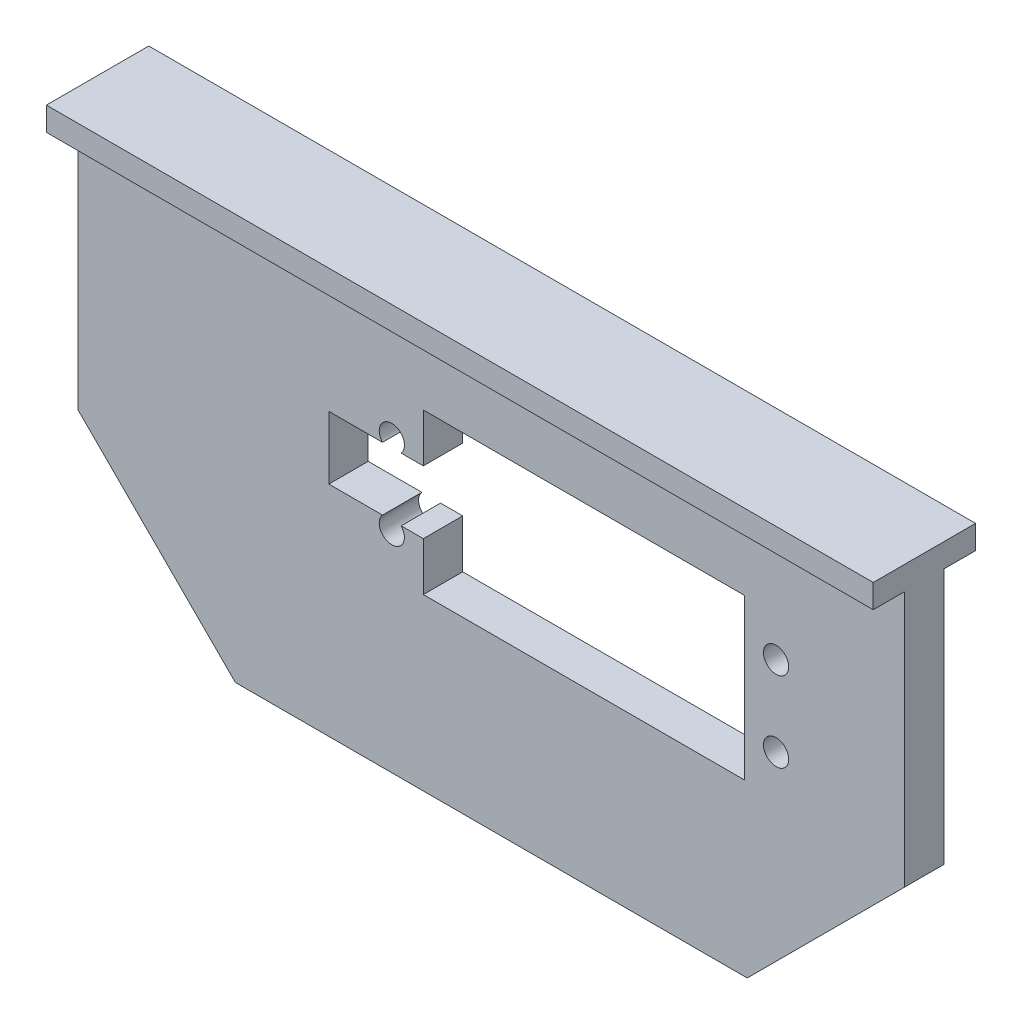
ISO-10303-21;
HEADER;
FILE_DESCRIPTION(('STEP AP214'),'2;1');
FILE_NAME('part.step','',(''),(''),'','','');
FILE_SCHEMA(('AUTOMOTIVE_DESIGN { 1 0 10303 214 1 1 1 1 }'));
ENDSEC;
DATA;
#1=APPLICATION_CONTEXT('core data for automotive mechanical design processes');
#2=APPLICATION_PROTOCOL_DEFINITION('international standard','automotive_design',2000,#1);
#3=PRODUCT_CONTEXT('',#1,'mechanical');
#4=PRODUCT('Part','Part','',(#3));
#5=PRODUCT_RELATED_PRODUCT_CATEGORY('part','',(#4));
#6=PRODUCT_DEFINITION_FORMATION('','',#4);
#7=PRODUCT_DEFINITION_CONTEXT('part definition',#1,'design');
#8=PRODUCT_DEFINITION('design','',#6,#7);
#9=PRODUCT_DEFINITION_SHAPE('','',#8);
#10=(LENGTH_UNIT() NAMED_UNIT(*) SI_UNIT(.MILLI.,.METRE.));
#11=(NAMED_UNIT(*) PLANE_ANGLE_UNIT() SI_UNIT($,.RADIAN.));
#12=(NAMED_UNIT(*) SI_UNIT($,.STERADIAN.) SOLID_ANGLE_UNIT());
#13=UNCERTAINTY_MEASURE_WITH_UNIT(LENGTH_MEASURE(1.E-05),#10,'distance_accuracy_value','');
#14=(GEOMETRIC_REPRESENTATION_CONTEXT(3) GLOBAL_UNCERTAINTY_ASSIGNED_CONTEXT((#13)) GLOBAL_UNIT_ASSIGNED_CONTEXT((#10,
#11,#12)) REPRESENTATION_CONTEXT('',''));
#15=CARTESIAN_POINT('',(0.,0.,0.));
#16=DIRECTION('',(0.,0.,1.));
#17=DIRECTION('',(1.,0.,0.));
#18=AXIS2_PLACEMENT_3D('',#15,#16,#17);
#19=CARTESIAN_POINT('',(43.8649815434946,-10.5968280050036,5.));
#20=DIRECTION('',(1.,0.,0.));
#21=DIRECTION('',(0.,0.,-1.));
#22=AXIS2_PLACEMENT_3D('',#19,#20,#21);
#23=PLANE('',#22);
#24=DIRECTION('',(0.,0.,1.));
#25=VECTOR('',#24,1.);
#26=CARTESIAN_POINT('',(43.8649815434946,-16.7468280050036,5.));
#27=LINE('',#26,#25);
#28=CARTESIAN_POINT('',(43.8649815434946,-16.7468280050036,0.));
#29=VERTEX_POINT('',#28);
#30=CARTESIAN_POINT('',(43.8649815434946,-16.7468280050036,5.));
#31=VERTEX_POINT('',#30);
#32=EDGE_CURVE('E243',#29,#31,#27,.T.);
#33=ORIENTED_EDGE('',*,*,#32,.F.);
#34=DIRECTION('',(0.,-1.,0.));
#35=VECTOR('',#34,1.);
#36=CARTESIAN_POINT('',(43.8649815434946,-10.5968280050036,0.));
#37=LINE('',#36,#35);
#38=CARTESIAN_POINT('',(43.8649815434946,-10.5968280050036,0.));
#39=VERTEX_POINT('',#38);
#40=EDGE_CURVE('E340',#39,#29,#37,.T.);
#41=ORIENTED_EDGE('',*,*,#40,.F.);
#42=DIRECTION('',(0.,0.,-1.));
#43=VECTOR('',#42,1.);
#44=CARTESIAN_POINT('',(43.8649815434946,-10.5968280050036,5.));
#45=LINE('',#44,#43);
#46=CARTESIAN_POINT('',(43.8649815434946,-10.5968280050036,5.));
#47=VERTEX_POINT('',#46);
#48=EDGE_CURVE('E339',#47,#39,#45,.T.);
#49=ORIENTED_EDGE('',*,*,#48,.F.);
#50=DIRECTION('',(0.,-1.,0.));
#51=VECTOR('',#50,1.);
#52=CARTESIAN_POINT('',(43.8649815434946,-10.5968280050036,5.));
#53=LINE('',#52,#51);
#54=EDGE_CURVE('E324',#47,#31,#53,.T.);
#55=ORIENTED_EDGE('',*,*,#54,.T.);
#56=EDGE_LOOP('',(#33,#41,#49,#55));
#57=FACE_BOUND('',#56,.T.);
#58=ADVANCED_FACE('F41',(#57),#23,.T.);
#59=CARTESIAN_POINT('',(0.,0.,5.));
#60=DIRECTION('',(0.,0.,-1.));
#61=DIRECTION('',(-1.,0.,0.));
#62=AXIS2_PLACEMENT_3D('',#59,#60,#61);
#63=PLANE('',#62);
#64=DIRECTION('',(1.,0.,0.));
#65=VECTOR('',#64,1.);
#66=CARTESIAN_POINT('',(0.,-52.5,5.));
#67=LINE('',#66,#65);
#68=CARTESIAN_POINT('',(20.,-52.5,5.));
#69=VERTEX_POINT('',#68);
#70=CARTESIAN_POINT('',(84.9999999999999,-52.5,5.));
#71=VERTEX_POINT('',#70);
#72=EDGE_CURVE('E378',#69,#71,#67,.T.);
#73=ORIENTED_EDGE('',*,*,#72,.T.);
#74=DIRECTION('',(-0.707106781186549,-0.707106781186546,0.));
#75=VECTOR('',#74,1.);
#76=CARTESIAN_POINT('',(105.,-32.5,5.));
#77=LINE('',#76,#75);
#78=CARTESIAN_POINT('',(105.,-32.5,5.));
#79=VERTEX_POINT('',#78);
#80=EDGE_CURVE('E51',#71,#79,#77,.F.);
#81=ORIENTED_EDGE('',*,*,#80,.T.);
#82=DIRECTION('',(0.,1.,0.));
#83=VECTOR('',#82,1.);
#84=CARTESIAN_POINT('',(105.,0.,5.));
#85=LINE('',#84,#83);
#86=CARTESIAN_POINT('',(105.,0.,5.));
#87=VERTEX_POINT('',#86);
#88=EDGE_CURVE('E381',#79,#87,#85,.T.);
#89=ORIENTED_EDGE('',*,*,#88,.T.);
#90=DIRECTION('',(-1.,0.,0.));
#91=VECTOR('',#90,1.);
#92=CARTESIAN_POINT('',(0.,0.,5.));
#93=LINE('',#92,#91);
#94=CARTESIAN_POINT('',(0.,0.,5.));
#95=VERTEX_POINT('',#94);
#96=EDGE_CURVE('E370',#87,#95,#93,.T.);
#97=ORIENTED_EDGE('',*,*,#96,.T.);
#98=DIRECTION('',(0.,-1.,0.));
#99=VECTOR('',#98,1.);
#100=CARTESIAN_POINT('',(0.,0.,5.));
#101=LINE('',#100,#99);
#102=CARTESIAN_POINT('',(0.,-32.4999999999999,5.));
#103=VERTEX_POINT('',#102);
#104=EDGE_CURVE('E374',#95,#103,#101,.T.);
#105=ORIENTED_EDGE('',*,*,#104,.T.);
#106=DIRECTION('',(-0.707106781186546,0.707106781186549,0.));
#107=VECTOR('',#106,1.);
#108=CARTESIAN_POINT('',(20.,-52.5,5.));
#109=LINE('',#108,#107);
#110=EDGE_CURVE('E425',#103,#69,#109,.F.);
#111=ORIENTED_EDGE('',*,*,#110,.T.);
#112=EDGE_LOOP('',(#73,#81,#89,#97,#105,#111));
#113=FACE_BOUND('',#112,.T.);
#114=CARTESIAN_POINT('',(39.8649815434946,-15.6718280050036,5.));
#115=DIRECTION('',(0.,0.,1.));
#116=DIRECTION('',(1.,0.,0.));
#117=AXIS2_PLACEMENT_3D('',#114,#115,#116);
#118=CIRCLE('',#117,1.6);
#119=CARTESIAN_POINT('',(41.0500448329438,-16.7468280050036,5.));
#120=VERTEX_POINT('',#119);
#121=CARTESIAN_POINT('',(38.6799182540455,-16.7468280050036,5.));
#122=VERTEX_POINT('',#121);
#123=EDGE_CURVE('E316',#120,#122,#118,.T.);
#124=ORIENTED_EDGE('',*,*,#123,.F.);
#125=DIRECTION('',(-1.,0.,0.));
#126=VECTOR('',#125,1.);
#127=CARTESIAN_POINT('',(55.8649815434946,-16.7468280050036,5.));
#128=LINE('',#127,#126);
#129=EDGE_CURVE('E205',#31,#120,#128,.T.);
#130=ORIENTED_EDGE('',*,*,#129,.F.);
#131=ORIENTED_EDGE('',*,*,#54,.F.);
#132=DIRECTION('',(-1.,0.,0.));
#133=VECTOR('',#132,1.);
#134=CARTESIAN_POINT('',(43.8649815434946,-10.5968280050036,5.));
#135=LINE('',#134,#133);
#136=CARTESIAN_POINT('',(84.6649815434946,-10.5968280050036,5.));
#137=VERTEX_POINT('',#136);
#138=EDGE_CURVE('E336',#137,#47,#135,.T.);
#139=ORIENTED_EDGE('',*,*,#138,.F.);
#140=DIRECTION('',(0.,1.,0.));
#141=VECTOR('',#140,1.);
#142=CARTESIAN_POINT('',(84.6649815434946,-10.5968280050036,5.));
#143=LINE('',#142,#141);
#144=CARTESIAN_POINT('',(84.6649815434946,-30.8968280050036,5.));
#145=VERTEX_POINT('',#144);
#146=EDGE_CURVE('E332',#145,#137,#143,.T.);
#147=ORIENTED_EDGE('',*,*,#146,.F.);
#148=DIRECTION('',(1.,0.,0.));
#149=VECTOR('',#148,1.);
#150=CARTESIAN_POINT('',(43.8649815434946,-30.8968280050036,5.));
#151=LINE('',#150,#149);
#152=CARTESIAN_POINT('',(43.8649815434946,-30.8968280050036,5.));
#153=VERTEX_POINT('',#152);
#154=EDGE_CURVE('E328',#153,#145,#151,.T.);
#155=ORIENTED_EDGE('',*,*,#154,.F.);
#156=CARTESIAN_POINT('',(43.8649815434946,-24.7468280050036,5.));
#157=VERTEX_POINT('',#156);
#158=EDGE_CURVE('E329',#157,#153,#53,.T.);
#159=ORIENTED_EDGE('',*,*,#158,.F.);
#160=DIRECTION('',(1.,0.,0.));
#161=VECTOR('',#160,1.);
#162=CARTESIAN_POINT('',(55.8649815434947,-24.7468280050036,5.));
#163=LINE('',#162,#161);
#164=CARTESIAN_POINT('',(41.0500448329438,-24.7468280050036,5.));
#165=VERTEX_POINT('',#164);
#166=EDGE_CURVE('E215',#165,#157,#163,.T.);
#167=ORIENTED_EDGE('',*,*,#166,.F.);
#168=CARTESIAN_POINT('',(39.8649815434946,-25.8218280050036,5.));
#169=DIRECTION('',(0.,0.,1.));
#170=DIRECTION('',(1.,0.,0.));
#171=AXIS2_PLACEMENT_3D('',#168,#169,#170);
#172=CIRCLE('',#171,1.6);
#173=CARTESIAN_POINT('',(38.6799182540455,-24.7468280050036,5.));
#174=VERTEX_POINT('',#173);
#175=EDGE_CURVE('E223',#174,#165,#172,.T.);
#176=ORIENTED_EDGE('',*,*,#175,.F.);
#177=CARTESIAN_POINT('',(31.8649815434946,-24.7468280050036,5.));
#178=VERTEX_POINT('',#177);
#179=EDGE_CURVE('E197',#178,#174,#163,.T.);
#180=ORIENTED_EDGE('',*,*,#179,.F.);
#181=DIRECTION('',(0.,-1.,0.));
#182=VECTOR('',#181,1.);
#183=CARTESIAN_POINT('',(31.8649815434946,-24.7468280050036,5.));
#184=LINE('',#183,#182);
#185=CARTESIAN_POINT('',(31.8649815434946,-16.7468280050036,5.));
#186=VERTEX_POINT('',#185);
#187=EDGE_CURVE('E208',#186,#178,#184,.T.);
#188=ORIENTED_EDGE('',*,*,#187,.F.);
#189=EDGE_CURVE('E225',#122,#186,#128,.T.);
#190=ORIENTED_EDGE('',*,*,#189,.F.);
#191=EDGE_LOOP('',(#124,#130,#131,#139,#147,#155,#159,#167,#176,#180,#188,#190));
#192=FACE_BOUND('',#191,.T.);
#193=CARTESIAN_POINT('',(88.6649815434946,-15.6718280050036,5.));
#194=DIRECTION('',(0.,0.,1.));
#195=DIRECTION('',(1.,0.,0.));
#196=AXIS2_PLACEMENT_3D('',#193,#194,#195);
#197=CIRCLE('',#196,1.6);
#198=CARTESIAN_POINT('',(90.2649815434946,-15.6718280050036,5.));
#199=VERTEX_POINT('',#198);
#200=EDGE_CURVE('E302',#199,#199,#197,.T.);
#201=ORIENTED_EDGE('',*,*,#200,.F.);
#202=EDGE_LOOP('',(#201));
#203=FACE_BOUND('',#202,.T.);
#204=CARTESIAN_POINT('',(88.6649815434946,-25.8218280050036,5.));
#205=DIRECTION('',(0.,0.,1.));
#206=DIRECTION('',(1.,0.,0.));
#207=AXIS2_PLACEMENT_3D('',#204,#205,#206);
#208=CIRCLE('',#207,1.60000000000002);
#209=CARTESIAN_POINT('',(90.2649815434947,-25.8218280050036,5.));
#210=VERTEX_POINT('',#209);
#211=EDGE_CURVE('E294',#210,#210,#208,.T.);
#212=ORIENTED_EDGE('',*,*,#211,.F.);
#213=EDGE_LOOP('',(#212));
#214=FACE_BOUND('',#213,.T.);
#215=ADVANCED_FACE('F219',(#113,#192,#203,#214),#63,.F.);
#216=CARTESIAN_POINT('',(0.,0.,0.));
#217=DIRECTION('',(0.,0.,-1.));
#218=DIRECTION('',(-1.,0.,0.));
#219=AXIS2_PLACEMENT_3D('',#216,#217,#218);
#220=PLANE('',#219);
#221=DIRECTION('',(1.,0.,0.));
#222=VECTOR('',#221,1.);
#223=CARTESIAN_POINT('',(0.,-16.7468280050036,0.));
#224=LINE('',#223,#222);
#225=CARTESIAN_POINT('',(41.0500448329438,-16.7468280050036,0.));
#226=VERTEX_POINT('',#225);
#227=EDGE_CURVE('E242',#226,#29,#224,.T.);
#228=ORIENTED_EDGE('',*,*,#227,.F.);
#229=CARTESIAN_POINT('',(39.8649815434946,-15.6718280050036,0.));
#230=DIRECTION('',(0.,0.,1.));
#231=DIRECTION('',(1.,0.,0.));
#232=AXIS2_PLACEMENT_3D('',#229,#230,#231);
#233=CIRCLE('',#232,1.6);
#234=CARTESIAN_POINT('',(38.6799182540455,-16.7468280050036,0.));
#235=VERTEX_POINT('',#234);
#236=EDGE_CURVE('E312',#226,#235,#233,.T.);
#237=ORIENTED_EDGE('',*,*,#236,.T.);
#238=CARTESIAN_POINT('',(31.8649815434946,-16.7468280050036,0.));
#239=VERTEX_POINT('',#238);
#240=EDGE_CURVE('E239',#239,#235,#224,.T.);
#241=ORIENTED_EDGE('',*,*,#240,.F.);
#242=DIRECTION('',(0.,1.,0.));
#243=VECTOR('',#242,1.);
#244=CARTESIAN_POINT('',(31.8649815434946,0.,0.));
#245=LINE('',#244,#243);
#246=CARTESIAN_POINT('',(31.8649815434946,-24.7468280050036,0.));
#247=VERTEX_POINT('',#246);
#248=EDGE_CURVE('E406',#247,#239,#245,.T.);
#249=ORIENTED_EDGE('',*,*,#248,.F.);
#250=DIRECTION('',(-1.,0.,0.));
#251=VECTOR('',#250,1.);
#252=CARTESIAN_POINT('',(0.,-24.7468280050036,0.));
#253=LINE('',#252,#251);
#254=CARTESIAN_POINT('',(38.6799182540455,-24.7468280050036,0.));
#255=VERTEX_POINT('',#254);
#256=EDGE_CURVE('E200',#255,#247,#253,.T.);
#257=ORIENTED_EDGE('',*,*,#256,.F.);
#258=CARTESIAN_POINT('',(39.8649815434946,-25.8218280050036,0.));
#259=DIRECTION('',(0.,0.,1.));
#260=DIRECTION('',(1.,0.,0.));
#261=AXIS2_PLACEMENT_3D('',#258,#259,#260);
#262=CIRCLE('',#261,1.6);
#263=CARTESIAN_POINT('',(41.0500448329438,-24.7468280050036,0.));
#264=VERTEX_POINT('',#263);
#265=EDGE_CURVE('E306',#255,#264,#262,.T.);
#266=ORIENTED_EDGE('',*,*,#265,.T.);
#267=CARTESIAN_POINT('',(43.8649815434946,-24.7468280050036,0.));
#268=VERTEX_POINT('',#267);
#269=EDGE_CURVE('E232',#268,#264,#253,.T.);
#270=ORIENTED_EDGE('',*,*,#269,.F.);
#271=CARTESIAN_POINT('',(43.8649815434946,-30.8968280050036,0.));
#272=VERTEX_POINT('',#271);
#273=EDGE_CURVE('E320',#268,#272,#37,.T.);
#274=ORIENTED_EDGE('',*,*,#273,.T.);
#275=DIRECTION('',(1.,0.,0.));
#276=VECTOR('',#275,1.);
#277=CARTESIAN_POINT('',(43.8649815434946,-30.8968280050036,0.));
#278=LINE('',#277,#276);
#279=CARTESIAN_POINT('',(84.6649815434946,-30.8968280050036,0.));
#280=VERTEX_POINT('',#279);
#281=EDGE_CURVE('E344',#272,#280,#278,.T.);
#282=ORIENTED_EDGE('',*,*,#281,.T.);
#283=DIRECTION('',(0.,1.,0.));
#284=VECTOR('',#283,1.);
#285=CARTESIAN_POINT('',(84.6649815434946,-10.5968280050036,0.));
#286=LINE('',#285,#284);
#287=CARTESIAN_POINT('',(84.6649815434946,-10.5968280050036,0.));
#288=VERTEX_POINT('',#287);
#289=EDGE_CURVE('E348',#280,#288,#286,.T.);
#290=ORIENTED_EDGE('',*,*,#289,.T.);
#291=DIRECTION('',(-1.,0.,0.));
#292=VECTOR('',#291,1.);
#293=CARTESIAN_POINT('',(43.8649815434946,-10.5968280050036,0.));
#294=LINE('',#293,#292);
#295=EDGE_CURVE('E352',#288,#39,#294,.T.);
#296=ORIENTED_EDGE('',*,*,#295,.T.);
#297=ORIENTED_EDGE('',*,*,#40,.T.);
#298=EDGE_LOOP('',(#228,#237,#241,#249,#257,#266,#270,#274,#282,#290,#296,#297));
#299=FACE_BOUND('',#298,.T.);
#300=CARTESIAN_POINT('',(88.6649815434946,-15.6718280050036,0.));
#301=DIRECTION('',(0.,0.,1.));
#302=DIRECTION('',(1.,0.,0.));
#303=AXIS2_PLACEMENT_3D('',#300,#301,#302);
#304=CIRCLE('',#303,1.6);
#305=CARTESIAN_POINT('',(90.2649815434946,-15.6718280050036,0.));
#306=VERTEX_POINT('',#305);
#307=EDGE_CURVE('E298',#306,#306,#304,.T.);
#308=ORIENTED_EDGE('',*,*,#307,.T.);
#309=EDGE_LOOP('',(#308));
#310=FACE_BOUND('',#309,.T.);
#311=DIRECTION('',(0.,1.,0.));
#312=VECTOR('',#311,1.);
#313=CARTESIAN_POINT('',(105.,0.,0.));
#314=LINE('',#313,#312);
#315=CARTESIAN_POINT('',(105.,-32.5,0.));
#316=VERTEX_POINT('',#315);
#317=CARTESIAN_POINT('',(105.,0.,0.));
#318=VERTEX_POINT('',#317);
#319=EDGE_CURVE('E375',#316,#318,#314,.T.);
#320=ORIENTED_EDGE('',*,*,#319,.F.);
#321=DIRECTION('',(0.707106781186549,0.707106781186546,0.));
#322=VECTOR('',#321,1.);
#323=CARTESIAN_POINT('',(68.7499999999998,-68.75,0.));
#324=LINE('',#323,#322);
#325=CARTESIAN_POINT('',(84.9999999999999,-52.5,0.));
#326=VERTEX_POINT('',#325);
#327=EDGE_CURVE('E416',#316,#326,#324,.F.);
#328=ORIENTED_EDGE('',*,*,#327,.T.);
#329=DIRECTION('',(1.,0.,0.));
#330=VECTOR('',#329,1.);
#331=CARTESIAN_POINT('',(0.,-52.5,0.));
#332=LINE('',#331,#330);
#333=CARTESIAN_POINT('',(20.,-52.5,0.));
#334=VERTEX_POINT('',#333);
#335=EDGE_CURVE('E390',#334,#326,#332,.T.);
#336=ORIENTED_EDGE('',*,*,#335,.F.);
#337=DIRECTION('',(0.707106781186546,-0.707106781186549,0.));
#338=VECTOR('',#337,1.);
#339=CARTESIAN_POINT('',(-16.25,-16.2499999999999,0.));
#340=LINE('',#339,#338);
#341=CARTESIAN_POINT('',(0.,-32.4999999999999,0.));
#342=VERTEX_POINT('',#341);
#343=EDGE_CURVE('E413',#334,#342,#340,.F.);
#344=ORIENTED_EDGE('',*,*,#343,.T.);
#345=DIRECTION('',(0.,-1.,0.));
#346=VECTOR('',#345,1.);
#347=CARTESIAN_POINT('',(0.,0.,0.));
#348=LINE('',#347,#346);
#349=CARTESIAN_POINT('',(0.,0.,0.));
#350=VERTEX_POINT('',#349);
#351=EDGE_CURVE('E387',#350,#342,#348,.T.);
#352=ORIENTED_EDGE('',*,*,#351,.F.);
#353=DIRECTION('',(-1.,0.,0.));
#354=VECTOR('',#353,1.);
#355=CARTESIAN_POINT('',(0.,0.,0.));
#356=LINE('',#355,#354);
#357=EDGE_CURVE('E369',#318,#350,#356,.T.);
#358=ORIENTED_EDGE('',*,*,#357,.F.);
#359=EDGE_LOOP('',(#320,#328,#336,#344,#352,#358));
#360=FACE_BOUND('',#359,.T.);
#361=CARTESIAN_POINT('',(88.6649815434946,-25.8218280050036,0.));
#362=DIRECTION('',(0.,0.,1.));
#363=DIRECTION('',(1.,0.,0.));
#364=AXIS2_PLACEMENT_3D('',#361,#362,#363);
#365=CIRCLE('',#364,1.60000000000002);
#366=CARTESIAN_POINT('',(90.2649815434947,-25.8218280050036,0.));
#367=VERTEX_POINT('',#366);
#368=EDGE_CURVE('E285',#367,#367,#365,.T.);
#369=ORIENTED_EDGE('',*,*,#368,.T.);
#370=EDGE_LOOP('',(#369));
#371=FACE_BOUND('',#370,.T.);
#372=ADVANCED_FACE('F442',(#299,#310,#360,#371),#220,.T.);
#373=CARTESIAN_POINT('',(0.,0.,5.));
#374=DIRECTION('',(1.,0.,0.));
#375=DIRECTION('',(0.,1.,0.));
#376=AXIS2_PLACEMENT_3D('',#373,#374,#375);
#377=PLANE('',#376);
#378=ORIENTED_EDGE('',*,*,#351,.T.);
#379=DIRECTION('',(0.,0.,1.));
#380=VECTOR('',#379,1.);
#381=CARTESIAN_POINT('',(0.,-32.4999999999999,5.));
#382=LINE('',#381,#380);
#383=EDGE_CURVE('E11',#342,#103,#382,.T.);
#384=ORIENTED_EDGE('',*,*,#383,.T.);
#385=ORIENTED_EDGE('',*,*,#104,.F.);
#386=DIRECTION('',(0.,0.,1.));
#387=VECTOR('',#386,1.);
#388=CARTESIAN_POINT('',(0.,0.,-4.));
#389=LINE('',#388,#387);
#390=CARTESIAN_POINT('',(0.,0.,9.));
#391=VERTEX_POINT('',#390);
#392=EDGE_CURVE('E277',#95,#391,#389,.T.);
#393=ORIENTED_EDGE('',*,*,#392,.T.);
#394=DIRECTION('',(0.,1.,0.));
#395=VECTOR('',#394,1.);
#396=CARTESIAN_POINT('',(0.,0.,9.));
#397=LINE('',#396,#395);
#398=CARTESIAN_POINT('',(0.,3.,9.));
#399=VERTEX_POINT('',#398);
#400=EDGE_CURVE('E246',#391,#399,#397,.T.);
#401=ORIENTED_EDGE('',*,*,#400,.T.);
#402=DIRECTION('',(0.,0.,-1.));
#403=VECTOR('',#402,1.);
#404=CARTESIAN_POINT('',(0.,3.,9.));
#405=LINE('',#404,#403);
#406=CARTESIAN_POINT('',(0.,3.,-4.));
#407=VERTEX_POINT('',#406);
#408=EDGE_CURVE('E269',#399,#407,#405,.T.);
#409=ORIENTED_EDGE('',*,*,#408,.T.);
#410=DIRECTION('',(0.,-1.,0.));
#411=VECTOR('',#410,1.);
#412=CARTESIAN_POINT('',(0.,3.,-4.));
#413=LINE('',#412,#411);
#414=CARTESIAN_POINT('',(0.,0.,-4.));
#415=VERTEX_POINT('',#414);
#416=EDGE_CURVE('E273',#407,#415,#413,.T.);
#417=ORIENTED_EDGE('',*,*,#416,.T.);
#418=EDGE_CURVE('E252',#415,#350,#389,.T.);
#419=ORIENTED_EDGE('',*,*,#418,.T.);
#420=EDGE_LOOP('',(#378,#384,#385,#393,#401,#409,#417,#419));
#421=FACE_BOUND('',#420,.T.);
#422=ADVANCED_FACE('F450',(#421),#377,.F.);
#423=CARTESIAN_POINT('',(0.,-52.5,5.));
#424=DIRECTION('',(0.,1.,0.));
#425=DIRECTION('',(0.,0.,1.));
#426=AXIS2_PLACEMENT_3D('',#423,#424,#425);
#427=PLANE('',#426);
#428=ORIENTED_EDGE('',*,*,#335,.T.);
#429=DIRECTION('',(0.,0.,1.));
#430=VECTOR('',#429,1.);
#431=CARTESIAN_POINT('',(84.9999999999999,-52.5,5.));
#432=LINE('',#431,#430);
#433=EDGE_CURVE('E64',#326,#71,#432,.T.);
#434=ORIENTED_EDGE('',*,*,#433,.T.);
#435=ORIENTED_EDGE('',*,*,#72,.F.);
#436=DIRECTION('',(0.,0.,-1.));
#437=VECTOR('',#436,1.);
#438=CARTESIAN_POINT('',(20.,-52.5,5.));
#439=LINE('',#438,#437);
#440=EDGE_CURVE('E419',#69,#334,#439,.T.);
#441=ORIENTED_EDGE('',*,*,#440,.T.);
#442=EDGE_LOOP('',(#428,#434,#435,#441));
#443=FACE_BOUND('',#442,.T.);
#444=ADVANCED_FACE('F445',(#443),#427,.F.);
#445=CARTESIAN_POINT('',(105.,0.,5.));
#446=DIRECTION('',(-1.,0.,0.));
#447=DIRECTION('',(0.,0.,1.));
#448=AXIS2_PLACEMENT_3D('',#445,#446,#447);
#449=PLANE('',#448);
#450=ORIENTED_EDGE('',*,*,#88,.F.);
#451=DIRECTION('',(0.,0.,-1.));
#452=VECTOR('',#451,1.);
#453=CARTESIAN_POINT('',(105.,-32.5,5.));
#454=LINE('',#453,#452);
#455=EDGE_CURVE('E409',#79,#316,#454,.T.);
#456=ORIENTED_EDGE('',*,*,#455,.T.);
#457=ORIENTED_EDGE('',*,*,#319,.T.);
#458=DIRECTION('',(0.,0.,1.));
#459=VECTOR('',#458,1.);
#460=CARTESIAN_POINT('',(105.,0.,-4.));
#461=LINE('',#460,#459);
#462=CARTESIAN_POINT('',(105.,0.,-4.));
#463=VERTEX_POINT('',#462);
#464=EDGE_CURVE('E261',#463,#318,#461,.T.);
#465=ORIENTED_EDGE('',*,*,#464,.F.);
#466=DIRECTION('',(0.,-1.,0.));
#467=VECTOR('',#466,1.);
#468=CARTESIAN_POINT('',(105.,3.,-4.));
#469=LINE('',#468,#467);
#470=CARTESIAN_POINT('',(105.,3.,-4.));
#471=VERTEX_POINT('',#470);
#472=EDGE_CURVE('E256',#471,#463,#469,.T.);
#473=ORIENTED_EDGE('',*,*,#472,.F.);
#474=DIRECTION('',(0.,0.,-1.));
#475=VECTOR('',#474,1.);
#476=CARTESIAN_POINT('',(105.,3.00000000000001,9.));
#477=LINE('',#476,#475);
#478=CARTESIAN_POINT('',(105.,3.00000000000001,9.));
#479=VERTEX_POINT('',#478);
#480=EDGE_CURVE('E251',#479,#471,#477,.T.);
#481=ORIENTED_EDGE('',*,*,#480,.F.);
#482=DIRECTION('',(0.,1.,0.));
#483=VECTOR('',#482,1.);
#484=CARTESIAN_POINT('',(105.,0.,9.));
#485=LINE('',#484,#483);
#486=CARTESIAN_POINT('',(105.,0.,9.));
#487=VERTEX_POINT('',#486);
#488=EDGE_CURVE('E247',#487,#479,#485,.T.);
#489=ORIENTED_EDGE('',*,*,#488,.F.);
#490=EDGE_CURVE('E260',#87,#487,#461,.T.);
#491=ORIENTED_EDGE('',*,*,#490,.F.);
#492=EDGE_LOOP('',(#450,#456,#457,#465,#473,#481,#489,#491));
#493=FACE_BOUND('',#492,.T.);
#494=ADVANCED_FACE('F436',(#493),#449,.F.);
#495=DIRECTION('',(0.,0.,-1.));
#496=VECTOR('',#495,1.);
#497=CARTESIAN_POINT('',(43.8649815434946,-24.7468280050036,5.));
#498=LINE('',#497,#496);
#499=EDGE_CURVE('E236',#157,#268,#498,.T.);
#500=ORIENTED_EDGE('',*,*,#499,.F.);
#501=ORIENTED_EDGE('',*,*,#158,.T.);
#502=DIRECTION('',(0.,0.,-1.));
#503=VECTOR('',#502,1.);
#504=CARTESIAN_POINT('',(43.8649815434946,-30.8968280050036,5.));
#505=LINE('',#504,#503);
#506=EDGE_CURVE('E365',#153,#272,#505,.T.);
#507=ORIENTED_EDGE('',*,*,#506,.T.);
#508=ORIENTED_EDGE('',*,*,#273,.F.);
#509=EDGE_LOOP('',(#500,#501,#507,#508));
#510=FACE_BOUND('',#509,.T.);
#511=ADVANCED_FACE('F512',(#510),#23,.T.);
#512=CARTESIAN_POINT('',(43.8649815434946,-30.8968280050036,5.));
#513=DIRECTION('',(0.,1.,0.));
#514=DIRECTION('',(-1.,0.,0.));
#515=AXIS2_PLACEMENT_3D('',#512,#513,#514);
#516=PLANE('',#515);
#517=ORIENTED_EDGE('',*,*,#281,.F.);
#518=ORIENTED_EDGE('',*,*,#506,.F.);
#519=ORIENTED_EDGE('',*,*,#154,.T.);
#520=DIRECTION('',(0.,0.,-1.));
#521=VECTOR('',#520,1.);
#522=CARTESIAN_POINT('',(84.6649815434946,-30.8968280050036,5.));
#523=LINE('',#522,#521);
#524=EDGE_CURVE('E362',#145,#280,#523,.T.);
#525=ORIENTED_EDGE('',*,*,#524,.T.);
#526=EDGE_LOOP('',(#517,#518,#519,#525));
#527=FACE_BOUND('',#526,.T.);
#528=ADVANCED_FACE('F503',(#527),#516,.T.);
#529=CARTESIAN_POINT('',(84.6649815434946,-10.5968280050036,5.));
#530=DIRECTION('',(-1.,0.,0.));
#531=DIRECTION('',(0.,0.,1.));
#532=AXIS2_PLACEMENT_3D('',#529,#530,#531);
#533=PLANE('',#532);
#534=ORIENTED_EDGE('',*,*,#289,.F.);
#535=ORIENTED_EDGE('',*,*,#524,.F.);
#536=ORIENTED_EDGE('',*,*,#146,.T.);
#537=DIRECTION('',(0.,0.,-1.));
#538=VECTOR('',#537,1.);
#539=CARTESIAN_POINT('',(84.6649815434946,-10.5968280050036,5.));
#540=LINE('',#539,#538);
#541=EDGE_CURVE('E359',#137,#288,#540,.T.);
#542=ORIENTED_EDGE('',*,*,#541,.T.);
#543=EDGE_LOOP('',(#534,#535,#536,#542));
#544=FACE_BOUND('',#543,.T.);
#545=ADVANCED_FACE('F500',(#544),#533,.T.);
#546=CARTESIAN_POINT('',(43.8649815434946,-10.5968280050036,5.));
#547=DIRECTION('',(0.,-1.,0.));
#548=DIRECTION('',(1.,0.,0.));
#549=AXIS2_PLACEMENT_3D('',#546,#547,#548);
#550=PLANE('',#549);
#551=ORIENTED_EDGE('',*,*,#295,.F.);
#552=ORIENTED_EDGE('',*,*,#541,.F.);
#553=ORIENTED_EDGE('',*,*,#138,.T.);
#554=ORIENTED_EDGE('',*,*,#48,.T.);
#555=EDGE_LOOP('',(#551,#552,#553,#554));
#556=FACE_BOUND('',#555,.T.);
#557=ADVANCED_FACE('F496',(#556),#550,.T.);
#558=CARTESIAN_POINT('',(39.8649815434946,-15.6718280050036,5.));
#559=DIRECTION('',(0.,0.,-1.));
#560=DIRECTION('',(-1.,0.,0.));
#561=AXIS2_PLACEMENT_3D('',#558,#559,#560);
#562=CYLINDRICAL_SURFACE('',#561,1.6);
#563=DIRECTION('',(0.,0.,-1.));
#564=VECTOR('',#563,1.);
#565=CARTESIAN_POINT('',(41.0500448329438,-16.7468280050036,5.));
#566=LINE('',#565,#564);
#567=EDGE_CURVE('E403',#120,#226,#566,.T.);
#568=ORIENTED_EDGE('',*,*,#567,.F.);
#569=ORIENTED_EDGE('',*,*,#123,.T.);
#570=DIRECTION('',(0.,0.,-1.));
#571=VECTOR('',#570,1.);
#572=CARTESIAN_POINT('',(38.6799182540455,-16.7468280050036,5.));
#573=LINE('',#572,#571);
#574=EDGE_CURVE('E400',#235,#122,#573,.F.);
#575=ORIENTED_EDGE('',*,*,#574,.F.);
#576=ORIENTED_EDGE('',*,*,#236,.F.);
#577=EDGE_LOOP('',(#568,#569,#575,#576));
#578=FACE_BOUND('',#577,.T.);
#579=ADVANCED_FACE('F482',(#578),#562,.F.);
#580=CARTESIAN_POINT('',(39.8649815434946,-25.8218280050036,5.));
#581=DIRECTION('',(0.,0.,-1.));
#582=DIRECTION('',(-1.,0.,0.));
#583=AXIS2_PLACEMENT_3D('',#580,#581,#582);
#584=CYLINDRICAL_SURFACE('',#583,1.6);
#585=DIRECTION('',(0.,0.,-1.));
#586=VECTOR('',#585,1.);
#587=CARTESIAN_POINT('',(38.6799182540455,-24.7468280050036,5.));
#588=LINE('',#587,#586);
#589=EDGE_CURVE('E397',#174,#255,#588,.T.);
#590=ORIENTED_EDGE('',*,*,#589,.F.);
#591=ORIENTED_EDGE('',*,*,#175,.T.);
#592=DIRECTION('',(0.,0.,-1.));
#593=VECTOR('',#592,1.);
#594=CARTESIAN_POINT('',(41.0500448329438,-24.7468280050036,5.));
#595=LINE('',#594,#593);
#596=EDGE_CURVE('E384',#264,#165,#595,.F.);
#597=ORIENTED_EDGE('',*,*,#596,.F.);
#598=ORIENTED_EDGE('',*,*,#265,.F.);
#599=EDGE_LOOP('',(#590,#591,#597,#598));
#600=FACE_BOUND('',#599,.T.);
#601=ADVANCED_FACE('F518',(#600),#584,.F.);
#602=CARTESIAN_POINT('',(88.6649815434946,-15.6718280050036,5.));
#603=DIRECTION('',(0.,0.,-1.));
#604=DIRECTION('',(-1.,0.,0.));
#605=AXIS2_PLACEMENT_3D('',#602,#603,#604);
#606=CYLINDRICAL_SURFACE('',#605,1.6);
#607=ORIENTED_EDGE('',*,*,#200,.T.);
#608=EDGE_LOOP('',(#607));
#609=FACE_BOUND('',#608,.T.);
#610=ORIENTED_EDGE('',*,*,#307,.F.);
#611=EDGE_LOOP('',(#610));
#612=FACE_BOUND('',#611,.T.);
#613=ADVANCED_FACE('F520',(#609,#612),#606,.F.);
#614=CARTESIAN_POINT('',(88.6649815434946,-25.8218280050036,5.));
#615=DIRECTION('',(0.,0.,-1.));
#616=DIRECTION('',(-1.,0.,0.));
#617=AXIS2_PLACEMENT_3D('',#614,#615,#616);
#618=CYLINDRICAL_SURFACE('',#617,1.60000000000002);
#619=ORIENTED_EDGE('',*,*,#211,.T.);
#620=EDGE_LOOP('',(#619));
#621=FACE_BOUND('',#620,.T.);
#622=ORIENTED_EDGE('',*,*,#368,.F.);
#623=EDGE_LOOP('',(#622));
#624=FACE_BOUND('',#623,.T.);
#625=ADVANCED_FACE('F526',(#621,#624),#618,.F.);
#626=CARTESIAN_POINT('',(105.,0.,-4.));
#627=DIRECTION('',(0.,-1.,0.));
#628=DIRECTION('',(0.,0.,-1.));
#629=AXIS2_PLACEMENT_3D('',#626,#627,#628);
#630=PLANE('',#629);
#631=ORIENTED_EDGE('',*,*,#96,.F.);
#632=ORIENTED_EDGE('',*,*,#490,.T.);
#633=DIRECTION('',(-1.,0.,0.));
#634=VECTOR('',#633,1.);
#635=CARTESIAN_POINT('',(105.,0.,9.));
#636=LINE('',#635,#634);
#637=EDGE_CURVE('E281',#487,#391,#636,.T.);
#638=ORIENTED_EDGE('',*,*,#637,.T.);
#639=ORIENTED_EDGE('',*,*,#392,.F.);
#640=EDGE_LOOP('',(#631,#632,#638,#639));
#641=FACE_BOUND('',#640,.T.);
#642=ADVANCED_FACE('F467',(#641),#630,.T.);
#643=CARTESIAN_POINT('',(105.,0.,9.));
#644=DIRECTION('',(0.,0.,1.));
#645=DIRECTION('',(1.,0.,0.));
#646=AXIS2_PLACEMENT_3D('',#643,#644,#645);
#647=PLANE('',#646);
#648=ORIENTED_EDGE('',*,*,#400,.F.);
#649=ORIENTED_EDGE('',*,*,#637,.F.);
#650=ORIENTED_EDGE('',*,*,#488,.T.);
#651=DIRECTION('',(-1.,0.,0.));
#652=VECTOR('',#651,1.);
#653=CARTESIAN_POINT('',(105.,3.00000000000001,9.));
#654=LINE('',#653,#652);
#655=EDGE_CURVE('E265',#479,#399,#654,.T.);
#656=ORIENTED_EDGE('',*,*,#655,.T.);
#657=EDGE_LOOP('',(#648,#649,#650,#656));
#658=FACE_BOUND('',#657,.T.);
#659=ADVANCED_FACE('F464',(#658),#647,.T.);
#660=ORIENTED_EDGE('',*,*,#464,.T.);
#661=ORIENTED_EDGE('',*,*,#357,.T.);
#662=ORIENTED_EDGE('',*,*,#418,.F.);
#663=DIRECTION('',(-1.,0.,0.));
#664=VECTOR('',#663,1.);
#665=CARTESIAN_POINT('',(105.,0.,-4.));
#666=LINE('',#665,#664);
#667=EDGE_CURVE('E286',#463,#415,#666,.T.);
#668=ORIENTED_EDGE('',*,*,#667,.F.);
#669=EDGE_LOOP('',(#660,#661,#662,#668));
#670=FACE_BOUND('',#669,.T.);
#671=ADVANCED_FACE('F454',(#670),#630,.T.);
#672=CARTESIAN_POINT('',(105.,3.,-4.));
#673=DIRECTION('',(0.,0.,-1.));
#674=DIRECTION('',(0.,1.,0.));
#675=AXIS2_PLACEMENT_3D('',#672,#673,#674);
#676=PLANE('',#675);
#677=ORIENTED_EDGE('',*,*,#416,.F.);
#678=DIRECTION('',(-1.,0.,0.));
#679=VECTOR('',#678,1.);
#680=CARTESIAN_POINT('',(105.,3.,-4.));
#681=LINE('',#680,#679);
#682=EDGE_CURVE('E289',#471,#407,#681,.T.);
#683=ORIENTED_EDGE('',*,*,#682,.F.);
#684=ORIENTED_EDGE('',*,*,#472,.T.);
#685=ORIENTED_EDGE('',*,*,#667,.T.);
#686=EDGE_LOOP('',(#677,#683,#684,#685));
#687=FACE_BOUND('',#686,.T.);
#688=ADVANCED_FACE('F572',(#687),#676,.T.);
#689=CARTESIAN_POINT('',(105.,3.00000000000001,9.));
#690=DIRECTION('',(0.,1.,0.));
#691=DIRECTION('',(0.,0.,1.));
#692=AXIS2_PLACEMENT_3D('',#689,#690,#691);
#693=PLANE('',#692);
#694=ORIENTED_EDGE('',*,*,#408,.F.);
#695=ORIENTED_EDGE('',*,*,#655,.F.);
#696=ORIENTED_EDGE('',*,*,#480,.T.);
#697=ORIENTED_EDGE('',*,*,#682,.T.);
#698=EDGE_LOOP('',(#694,#695,#696,#697));
#699=FACE_BOUND('',#698,.T.);
#700=ADVANCED_FACE('F461',(#699),#693,.T.);
#701=CARTESIAN_POINT('',(55.8649815434947,-24.7468280050036,-4.));
#702=DIRECTION('',(0.,-1.,0.));
#703=DIRECTION('',(0.,0.,-1.));
#704=AXIS2_PLACEMENT_3D('',#701,#702,#703);
#705=PLANE('',#704);
#706=ORIENTED_EDGE('',*,*,#499,.T.);
#707=ORIENTED_EDGE('',*,*,#269,.T.);
#708=ORIENTED_EDGE('',*,*,#596,.T.);
#709=ORIENTED_EDGE('',*,*,#166,.T.);
#710=EDGE_LOOP('',(#706,#707,#708,#709));
#711=FACE_BOUND('',#710,.T.);
#712=ADVANCED_FACE('F514',(#711),#705,.F.);
#713=CARTESIAN_POINT('',(55.8649815434946,-16.7468280050036,-4.));
#714=DIRECTION('',(0.,1.,0.));
#715=DIRECTION('',(0.,0.,1.));
#716=AXIS2_PLACEMENT_3D('',#713,#714,#715);
#717=PLANE('',#716);
#718=ORIENTED_EDGE('',*,*,#240,.T.);
#719=ORIENTED_EDGE('',*,*,#574,.T.);
#720=ORIENTED_EDGE('',*,*,#189,.T.);
#721=DIRECTION('',(0.,0.,1.));
#722=VECTOR('',#721,1.);
#723=CARTESIAN_POINT('',(31.8649815434946,-16.7468280050036,-4.));
#724=LINE('',#723,#722);
#725=EDGE_CURVE('E204',#239,#186,#724,.T.);
#726=ORIENTED_EDGE('',*,*,#725,.F.);
#727=EDGE_LOOP('',(#718,#719,#720,#726));
#728=FACE_BOUND('',#727,.T.);
#729=ADVANCED_FACE('F485',(#728),#717,.F.);
#730=ORIENTED_EDGE('',*,*,#256,.T.);
#731=DIRECTION('',(0.,0.,1.));
#732=VECTOR('',#731,1.);
#733=CARTESIAN_POINT('',(31.8649815434946,-24.7468280050036,-4.));
#734=LINE('',#733,#732);
#735=EDGE_CURVE('E193',#247,#178,#734,.T.);
#736=ORIENTED_EDGE('',*,*,#735,.T.);
#737=ORIENTED_EDGE('',*,*,#179,.T.);
#738=ORIENTED_EDGE('',*,*,#589,.T.);
#739=EDGE_LOOP('',(#730,#736,#737,#738));
#740=FACE_BOUND('',#739,.T.);
#741=ADVANCED_FACE('F195',(#740),#705,.F.);
#742=CARTESIAN_POINT('',(31.8649815434946,-24.7468280050036,-4.));
#743=DIRECTION('',(-1.,0.,0.));
#744=DIRECTION('',(0.,0.,1.));
#745=AXIS2_PLACEMENT_3D('',#742,#743,#744);
#746=PLANE('',#745);
#747=ORIENTED_EDGE('',*,*,#248,.T.);
#748=ORIENTED_EDGE('',*,*,#725,.T.);
#749=ORIENTED_EDGE('',*,*,#187,.T.);
#750=ORIENTED_EDGE('',*,*,#735,.F.);
#751=EDGE_LOOP('',(#747,#748,#749,#750));
#752=FACE_BOUND('',#751,.T.);
#753=ADVANCED_FACE('F209',(#752),#746,.F.);
#754=ORIENTED_EDGE('',*,*,#32,.T.);
#755=ORIENTED_EDGE('',*,*,#129,.T.);
#756=ORIENTED_EDGE('',*,*,#567,.T.);
#757=ORIENTED_EDGE('',*,*,#227,.T.);
#758=EDGE_LOOP('',(#754,#755,#756,#757));
#759=FACE_BOUND('',#758,.T.);
#760=ADVANCED_FACE('F476',(#759),#717,.F.);
#761=CARTESIAN_POINT('',(105.,-32.5,5.));
#762=DIRECTION('',(-0.707106781186546,0.707106781186549,0.));
#763=DIRECTION('',(0.,0.,-1.));
#764=AXIS2_PLACEMENT_3D('',#761,#762,#763);
#765=PLANE('',#764);
#766=ORIENTED_EDGE('',*,*,#80,.F.);
#767=ORIENTED_EDGE('',*,*,#433,.F.);
#768=ORIENTED_EDGE('',*,*,#327,.F.);
#769=ORIENTED_EDGE('',*,*,#455,.F.);
#770=EDGE_LOOP('',(#766,#767,#768,#769));
#771=FACE_BOUND('',#770,.T.);
#772=ADVANCED_FACE('F439',(#771),#765,.F.);
#773=CARTESIAN_POINT('',(20.,-52.5,5.));
#774=DIRECTION('',(0.707106781186549,0.707106781186546,0.));
#775=DIRECTION('',(0.,0.,-1.));
#776=AXIS2_PLACEMENT_3D('',#773,#774,#775);
#777=PLANE('',#776);
#778=ORIENTED_EDGE('',*,*,#110,.F.);
#779=ORIENTED_EDGE('',*,*,#383,.F.);
#780=ORIENTED_EDGE('',*,*,#343,.F.);
#781=ORIENTED_EDGE('',*,*,#440,.F.);
#782=EDGE_LOOP('',(#778,#779,#780,#781));
#783=FACE_BOUND('',#782,.T.);
#784=ADVANCED_FACE('F44',(#783),#777,.F.);
#785=CLOSED_SHELL('',(#58,#215,#372,#422,#444,#494,#511,#528,#545,#557,#579,#601,#613,#625,#642,
#659,#671,#688,#700,#712,#729,#741,#753,#760,#772,#784));
#786=MANIFOLD_SOLID_BREP('B2',#785);
#787=ADVANCED_BREP_SHAPE_REPRESENTATION('',(#18,#786),#14);
#788=SHAPE_DEFINITION_REPRESENTATION(#9,#787);
ENDSEC;
END-ISO-10303-21;
